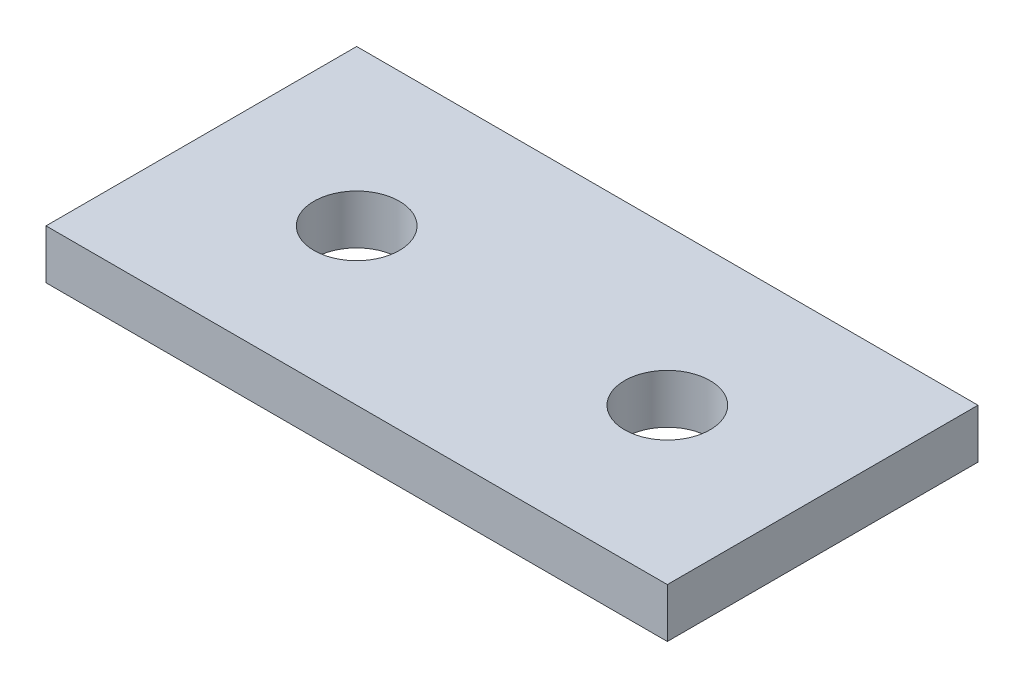
ISO-10303-21;
HEADER;
FILE_DESCRIPTION(('STEP AP214'),'2;1');
FILE_NAME('part.step','',(''),(''),'','','');
FILE_SCHEMA(('AUTOMOTIVE_DESIGN { 1 0 10303 214 1 1 1 1 }'));
ENDSEC;
DATA;
#1=APPLICATION_CONTEXT('core data for automotive mechanical design processes');
#2=APPLICATION_PROTOCOL_DEFINITION('international standard','automotive_design',2000,#1);
#3=PRODUCT_CONTEXT('',#1,'mechanical');
#4=PRODUCT('Part','Part','',(#3));
#5=PRODUCT_RELATED_PRODUCT_CATEGORY('part','',(#4));
#6=PRODUCT_DEFINITION_FORMATION('','',#4);
#7=PRODUCT_DEFINITION_CONTEXT('part definition',#1,'design');
#8=PRODUCT_DEFINITION('design','',#6,#7);
#9=PRODUCT_DEFINITION_SHAPE('','',#8);
#10=(LENGTH_UNIT() NAMED_UNIT(*) SI_UNIT(.MILLI.,.METRE.));
#11=(NAMED_UNIT(*) PLANE_ANGLE_UNIT() SI_UNIT($,.RADIAN.));
#12=(NAMED_UNIT(*) SI_UNIT($,.STERADIAN.) SOLID_ANGLE_UNIT());
#13=UNCERTAINTY_MEASURE_WITH_UNIT(LENGTH_MEASURE(1.E-05),#10,'distance_accuracy_value','');
#14=(GEOMETRIC_REPRESENTATION_CONTEXT(3) GLOBAL_UNCERTAINTY_ASSIGNED_CONTEXT((#13)) GLOBAL_UNIT_ASSIGNED_CONTEXT((#10,
#11,#12)) REPRESENTATION_CONTEXT('',''));
#15=CARTESIAN_POINT('',(0.,0.,0.));
#16=DIRECTION('',(0.,0.,1.));
#17=DIRECTION('',(1.,0.,0.));
#18=AXIS2_PLACEMENT_3D('',#15,#16,#17);
#19=CARTESIAN_POINT('',(0.,3.175,0.));
#20=DIRECTION('',(0.,-1.,0.));
#21=DIRECTION('',(0.,0.,-1.));
#22=AXIS2_PLACEMENT_3D('',#19,#20,#21);
#23=PLANE('',#22);
#24=DIRECTION('',(0.,0.,-1.));
#25=VECTOR('',#24,1.);
#26=CARTESIAN_POINT('',(20.,3.175,10.));
#27=LINE('',#26,#25);
#28=CARTESIAN_POINT('',(20.,3.175,10.));
#29=VERTEX_POINT('',#28);
#30=CARTESIAN_POINT('',(20.,3.175,-10.));
#31=VERTEX_POINT('',#30);
#32=EDGE_CURVE('E85',#29,#31,#27,.T.);
#33=ORIENTED_EDGE('',*,*,#32,.T.);
#34=DIRECTION('',(-1.,0.,0.));
#35=VECTOR('',#34,1.);
#36=CARTESIAN_POINT('',(-20.,3.175,-10.));
#37=LINE('',#36,#35);
#38=CARTESIAN_POINT('',(-20.,3.175,-10.));
#39=VERTEX_POINT('',#38);
#40=EDGE_CURVE('E80',#31,#39,#37,.T.);
#41=ORIENTED_EDGE('',*,*,#40,.T.);
#42=DIRECTION('',(0.,0.,1.));
#43=VECTOR('',#42,1.);
#44=CARTESIAN_POINT('',(-20.,3.175,10.));
#45=LINE('',#44,#43);
#46=CARTESIAN_POINT('',(-20.,3.175,10.));
#47=VERTEX_POINT('',#46);
#48=EDGE_CURVE('E83',#39,#47,#45,.T.);
#49=ORIENTED_EDGE('',*,*,#48,.T.);
#50=DIRECTION('',(1.,0.,0.));
#51=VECTOR('',#50,1.);
#52=CARTESIAN_POINT('',(-20.,3.175,10.));
#53=LINE('',#52,#51);
#54=EDGE_CURVE('E50',#47,#29,#53,.T.);
#55=ORIENTED_EDGE('',*,*,#54,.T.);
#56=EDGE_LOOP('',(#33,#41,#49,#55));
#57=FACE_BOUND('',#56,.T.);
#58=CARTESIAN_POINT('',(-10.,3.175,0.));
#59=DIRECTION('',(0.,1.,0.));
#60=DIRECTION('',(0.,0.,1.));
#61=AXIS2_PLACEMENT_3D('',#58,#59,#60);
#62=CIRCLE('',#61,2.75);
#63=CARTESIAN_POINT('',(-10.,3.175,2.75));
#64=VERTEX_POINT('',#63);
#65=EDGE_CURVE('E100',#64,#64,#62,.T.);
#66=ORIENTED_EDGE('',*,*,#65,.F.);
#67=EDGE_LOOP('',(#66));
#68=FACE_BOUND('',#67,.T.);
#69=CARTESIAN_POINT('',(10.,3.175,0.));
#70=DIRECTION('',(0.,1.,0.));
#71=DIRECTION('',(0.,0.,1.));
#72=AXIS2_PLACEMENT_3D('',#69,#70,#71);
#73=CIRCLE('',#72,2.75);
#74=CARTESIAN_POINT('',(10.,3.175,2.75));
#75=VERTEX_POINT('',#74);
#76=EDGE_CURVE('E115',#75,#75,#73,.T.);
#77=ORIENTED_EDGE('',*,*,#76,.F.);
#78=EDGE_LOOP('',(#77));
#79=FACE_BOUND('',#78,.T.);
#80=ADVANCED_FACE('F33',(#57,#68,#79),#23,.F.);
#81=CARTESIAN_POINT('',(0.,0.,0.));
#82=DIRECTION('',(0.,-1.,0.));
#83=DIRECTION('',(0.,0.,-1.));
#84=AXIS2_PLACEMENT_3D('',#81,#82,#83);
#85=PLANE('',#84);
#86=CARTESIAN_POINT('',(-10.,0.,0.));
#87=DIRECTION('',(0.,1.,0.));
#88=DIRECTION('',(0.,0.,1.));
#89=AXIS2_PLACEMENT_3D('',#86,#87,#88);
#90=CIRCLE('',#89,2.75);
#91=CARTESIAN_POINT('',(-10.,0.,2.75));
#92=VERTEX_POINT('',#91);
#93=EDGE_CURVE('E112',#92,#92,#90,.T.);
#94=ORIENTED_EDGE('',*,*,#93,.T.);
#95=EDGE_LOOP('',(#94));
#96=FACE_BOUND('',#95,.T.);
#97=DIRECTION('',(0.,0.,-1.));
#98=VECTOR('',#97,1.);
#99=CARTESIAN_POINT('',(20.,0.,10.));
#100=LINE('',#99,#98);
#101=CARTESIAN_POINT('',(20.,0.,10.));
#102=VERTEX_POINT('',#101);
#103=CARTESIAN_POINT('',(20.,0.,-10.));
#104=VERTEX_POINT('',#103);
#105=EDGE_CURVE('E97',#102,#104,#100,.T.);
#106=ORIENTED_EDGE('',*,*,#105,.F.);
#107=DIRECTION('',(1.,0.,0.));
#108=VECTOR('',#107,1.);
#109=CARTESIAN_POINT('',(-20.,0.,10.));
#110=LINE('',#109,#108);
#111=CARTESIAN_POINT('',(-20.,0.,10.));
#112=VERTEX_POINT('',#111);
#113=EDGE_CURVE('E73',#112,#102,#110,.T.);
#114=ORIENTED_EDGE('',*,*,#113,.F.);
#115=DIRECTION('',(0.,0.,1.));
#116=VECTOR('',#115,1.);
#117=CARTESIAN_POINT('',(-20.,0.,10.));
#118=LINE('',#117,#116);
#119=CARTESIAN_POINT('',(-20.,0.,-10.));
#120=VERTEX_POINT('',#119);
#121=EDGE_CURVE('E67',#120,#112,#118,.T.);
#122=ORIENTED_EDGE('',*,*,#121,.F.);
#123=DIRECTION('',(-1.,0.,0.));
#124=VECTOR('',#123,1.);
#125=CARTESIAN_POINT('',(-20.,0.,-10.));
#126=LINE('',#125,#124);
#127=EDGE_CURVE('E89',#104,#120,#126,.T.);
#128=ORIENTED_EDGE('',*,*,#127,.F.);
#129=EDGE_LOOP('',(#106,#114,#122,#128));
#130=FACE_BOUND('',#129,.T.);
#131=CARTESIAN_POINT('',(10.,0.,0.));
#132=DIRECTION('',(0.,1.,0.));
#133=DIRECTION('',(0.,0.,1.));
#134=AXIS2_PLACEMENT_3D('',#131,#132,#133);
#135=CIRCLE('',#134,2.75);
#136=CARTESIAN_POINT('',(10.,0.,2.75));
#137=VERTEX_POINT('',#136);
#138=EDGE_CURVE('E118',#137,#137,#135,.T.);
#139=ORIENTED_EDGE('',*,*,#138,.T.);
#140=EDGE_LOOP('',(#139));
#141=FACE_BOUND('',#140,.T.);
#142=ADVANCED_FACE('F108',(#96,#130,#141),#85,.T.);
#143=CARTESIAN_POINT('',(20.,3.175,10.));
#144=DIRECTION('',(-1.,0.,0.));
#145=DIRECTION('',(0.,0.,1.));
#146=AXIS2_PLACEMENT_3D('',#143,#144,#145);
#147=PLANE('',#146);
#148=ORIENTED_EDGE('',*,*,#105,.T.);
#149=DIRECTION('',(0.,-1.,0.));
#150=VECTOR('',#149,1.);
#151=CARTESIAN_POINT('',(20.,3.175,-10.));
#152=LINE('',#151,#150);
#153=EDGE_CURVE('E11',#31,#104,#152,.T.);
#154=ORIENTED_EDGE('',*,*,#153,.F.);
#155=ORIENTED_EDGE('',*,*,#32,.F.);
#156=DIRECTION('',(0.,-1.,0.));
#157=VECTOR('',#156,1.);
#158=CARTESIAN_POINT('',(20.,3.175,10.));
#159=LINE('',#158,#157);
#160=EDGE_CURVE('E93',#29,#102,#159,.T.);
#161=ORIENTED_EDGE('',*,*,#160,.T.);
#162=EDGE_LOOP('',(#148,#154,#155,#161));
#163=FACE_BOUND('',#162,.T.);
#164=ADVANCED_FACE('F35',(#163),#147,.F.);
#165=CARTESIAN_POINT('',(-20.,3.175,-10.));
#166=DIRECTION('',(0.,0.,1.));
#167=DIRECTION('',(1.,0.,0.));
#168=AXIS2_PLACEMENT_3D('',#165,#166,#167);
#169=PLANE('',#168);
#170=ORIENTED_EDGE('',*,*,#127,.T.);
#171=DIRECTION('',(0.,-1.,0.));
#172=VECTOR('',#171,1.);
#173=CARTESIAN_POINT('',(-20.,3.175,-10.));
#174=LINE('',#173,#172);
#175=EDGE_CURVE('E42',#39,#120,#174,.T.);
#176=ORIENTED_EDGE('',*,*,#175,.F.);
#177=ORIENTED_EDGE('',*,*,#40,.F.);
#178=ORIENTED_EDGE('',*,*,#153,.T.);
#179=EDGE_LOOP('',(#170,#176,#177,#178));
#180=FACE_BOUND('',#179,.T.);
#181=ADVANCED_FACE('F88',(#180),#169,.F.);
#182=CARTESIAN_POINT('',(-20.,3.175,10.));
#183=DIRECTION('',(1.,0.,0.));
#184=DIRECTION('',(0.,0.,-1.));
#185=AXIS2_PLACEMENT_3D('',#182,#183,#184);
#186=PLANE('',#185);
#187=ORIENTED_EDGE('',*,*,#121,.T.);
#188=DIRECTION('',(0.,-1.,0.));
#189=VECTOR('',#188,1.);
#190=CARTESIAN_POINT('',(-20.,3.175,10.));
#191=LINE('',#190,#189);
#192=EDGE_CURVE('E90',#47,#112,#191,.T.);
#193=ORIENTED_EDGE('',*,*,#192,.F.);
#194=ORIENTED_EDGE('',*,*,#48,.F.);
#195=ORIENTED_EDGE('',*,*,#175,.T.);
#196=EDGE_LOOP('',(#187,#193,#194,#195));
#197=FACE_BOUND('',#196,.T.);
#198=ADVANCED_FACE('F91',(#197),#186,.F.);
#199=CARTESIAN_POINT('',(-20.,3.175,10.));
#200=DIRECTION('',(0.,0.,-1.));
#201=DIRECTION('',(-1.,0.,0.));
#202=AXIS2_PLACEMENT_3D('',#199,#200,#201);
#203=PLANE('',#202);
#204=ORIENTED_EDGE('',*,*,#113,.T.);
#205=ORIENTED_EDGE('',*,*,#160,.F.);
#206=ORIENTED_EDGE('',*,*,#54,.F.);
#207=ORIENTED_EDGE('',*,*,#192,.T.);
#208=EDGE_LOOP('',(#204,#205,#206,#207));
#209=FACE_BOUND('',#208,.T.);
#210=ADVANCED_FACE('F105',(#209),#203,.F.);
#211=CARTESIAN_POINT('',(-10.,3.175,0.));
#212=DIRECTION('',(0.,-1.,0.));
#213=DIRECTION('',(0.,0.,-1.));
#214=AXIS2_PLACEMENT_3D('',#211,#212,#213);
#215=CYLINDRICAL_SURFACE('',#214,2.75);
#216=ORIENTED_EDGE('',*,*,#65,.T.);
#217=EDGE_LOOP('',(#216));
#218=FACE_BOUND('',#217,.T.);
#219=ORIENTED_EDGE('',*,*,#93,.F.);
#220=EDGE_LOOP('',(#219));
#221=FACE_BOUND('',#220,.T.);
#222=ADVANCED_FACE('F135',(#218,#221),#215,.F.);
#223=CARTESIAN_POINT('',(10.,3.175,0.));
#224=DIRECTION('',(0.,-1.,0.));
#225=DIRECTION('',(0.,0.,-1.));
#226=AXIS2_PLACEMENT_3D('',#223,#224,#225);
#227=CYLINDRICAL_SURFACE('',#226,2.75);
#228=ORIENTED_EDGE('',*,*,#76,.T.);
#229=EDGE_LOOP('',(#228));
#230=FACE_BOUND('',#229,.T.);
#231=ORIENTED_EDGE('',*,*,#138,.F.);
#232=EDGE_LOOP('',(#231));
#233=FACE_BOUND('',#232,.T.);
#234=ADVANCED_FACE('F124',(#230,#233),#227,.F.);
#235=CLOSED_SHELL('',(#80,#142,#164,#181,#198,#210,#222,#234));
#236=MANIFOLD_SOLID_BREP('B2',#235);
#237=ADVANCED_BREP_SHAPE_REPRESENTATION('',(#18,#236),#14);
#238=SHAPE_DEFINITION_REPRESENTATION(#9,#237);
ENDSEC;
END-ISO-10303-21;
